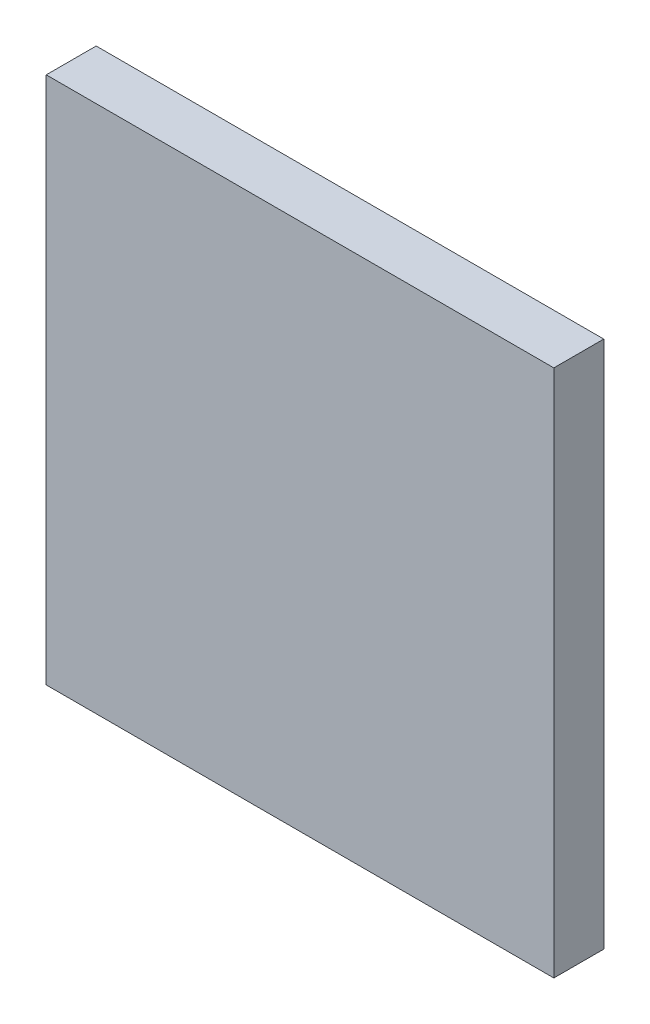
ISO-10303-21;
HEADER;
FILE_DESCRIPTION(('STEP AP214'),'2;1');
FILE_NAME('part.step','',(''),(''),'','','');
FILE_SCHEMA(('AUTOMOTIVE_DESIGN { 1 0 10303 214 1 1 1 1 }'));
ENDSEC;
DATA;
#1=APPLICATION_CONTEXT('core data for automotive mechanical design processes');
#2=APPLICATION_PROTOCOL_DEFINITION('international standard','automotive_design',2000,#1);
#3=PRODUCT_CONTEXT('',#1,'mechanical');
#4=PRODUCT('Part','Part','',(#3));
#5=PRODUCT_RELATED_PRODUCT_CATEGORY('part','',(#4));
#6=PRODUCT_DEFINITION_FORMATION('','',#4);
#7=PRODUCT_DEFINITION_CONTEXT('part definition',#1,'design');
#8=PRODUCT_DEFINITION('design','',#6,#7);
#9=PRODUCT_DEFINITION_SHAPE('','',#8);
#10=(LENGTH_UNIT() NAMED_UNIT(*) SI_UNIT(.MILLI.,.METRE.));
#11=(NAMED_UNIT(*) PLANE_ANGLE_UNIT() SI_UNIT($,.RADIAN.));
#12=(NAMED_UNIT(*) SI_UNIT($,.STERADIAN.) SOLID_ANGLE_UNIT());
#13=UNCERTAINTY_MEASURE_WITH_UNIT(LENGTH_MEASURE(1.E-05),#10,'distance_accuracy_value','');
#14=(GEOMETRIC_REPRESENTATION_CONTEXT(3) GLOBAL_UNCERTAINTY_ASSIGNED_CONTEXT((#13)) GLOBAL_UNIT_ASSIGNED_CONTEXT((#10,
#11,#12)) REPRESENTATION_CONTEXT('',''));
#15=CARTESIAN_POINT('',(0.,0.,0.));
#16=DIRECTION('',(0.,0.,1.));
#17=DIRECTION('',(1.,0.,0.));
#18=AXIS2_PLACEMENT_3D('',#15,#16,#17);
#19=CARTESIAN_POINT('',(122.,127.,24.));
#20=DIRECTION('',(-1.,0.,0.));
#21=DIRECTION('',(0.,-1.,0.));
#22=AXIS2_PLACEMENT_3D('',#19,#20,#21);
#23=PLANE('',#22);
#24=DIRECTION('',(0.,1.,0.));
#25=VECTOR('',#24,1.);
#26=CARTESIAN_POINT('',(122.,127.,0.));
#27=LINE('',#26,#25);
#28=CARTESIAN_POINT('',(122.,-127.,0.));
#29=VERTEX_POINT('',#28);
#30=CARTESIAN_POINT('',(122.,127.,0.));
#31=VERTEX_POINT('',#30);
#32=EDGE_CURVE('E105',#29,#31,#27,.T.);
#33=ORIENTED_EDGE('',*,*,#32,.T.);
#34=DIRECTION('',(0.,0.,-1.));
#35=VECTOR('',#34,1.);
#36=CARTESIAN_POINT('',(122.,127.,24.));
#37=LINE('',#36,#35);
#38=CARTESIAN_POINT('',(122.,127.,24.));
#39=VERTEX_POINT('',#38);
#40=EDGE_CURVE('E11',#39,#31,#37,.T.);
#41=ORIENTED_EDGE('',*,*,#40,.F.);
#42=DIRECTION('',(0.,1.,0.));
#43=VECTOR('',#42,1.);
#44=CARTESIAN_POINT('',(122.,127.,24.));
#45=LINE('',#44,#43);
#46=CARTESIAN_POINT('',(122.,-127.,24.));
#47=VERTEX_POINT('',#46);
#48=EDGE_CURVE('E93',#47,#39,#45,.T.);
#49=ORIENTED_EDGE('',*,*,#48,.F.);
#50=DIRECTION('',(0.,0.,-1.));
#51=VECTOR('',#50,1.);
#52=CARTESIAN_POINT('',(122.,-127.,24.));
#53=LINE('',#52,#51);
#54=EDGE_CURVE('E101',#47,#29,#53,.T.);
#55=ORIENTED_EDGE('',*,*,#54,.T.);
#56=EDGE_LOOP('',(#33,#41,#49,#55));
#57=FACE_BOUND('',#56,.T.);
#58=ADVANCED_FACE('F42',(#57),#23,.F.);
#59=CARTESIAN_POINT('',(-122.,127.,24.));
#60=DIRECTION('',(0.,-1.,0.));
#61=DIRECTION('',(0.,0.,-1.));
#62=AXIS2_PLACEMENT_3D('',#59,#60,#61);
#63=PLANE('',#62);
#64=DIRECTION('',(-1.,0.,0.));
#65=VECTOR('',#64,1.);
#66=CARTESIAN_POINT('',(-122.,127.,0.));
#67=LINE('',#66,#65);
#68=CARTESIAN_POINT('',(-122.,127.,0.));
#69=VERTEX_POINT('',#68);
#70=EDGE_CURVE('E97',#31,#69,#67,.T.);
#71=ORIENTED_EDGE('',*,*,#70,.T.);
#72=DIRECTION('',(0.,0.,-1.));
#73=VECTOR('',#72,1.);
#74=CARTESIAN_POINT('',(-122.,127.,24.));
#75=LINE('',#74,#73);
#76=CARTESIAN_POINT('',(-122.,127.,24.));
#77=VERTEX_POINT('',#76);
#78=EDGE_CURVE('E50',#77,#69,#75,.T.);
#79=ORIENTED_EDGE('',*,*,#78,.F.);
#80=DIRECTION('',(-1.,0.,0.));
#81=VECTOR('',#80,1.);
#82=CARTESIAN_POINT('',(-122.,127.,24.));
#83=LINE('',#82,#81);
#84=EDGE_CURVE('E88',#39,#77,#83,.T.);
#85=ORIENTED_EDGE('',*,*,#84,.F.);
#86=ORIENTED_EDGE('',*,*,#40,.T.);
#87=EDGE_LOOP('',(#71,#79,#85,#86));
#88=FACE_BOUND('',#87,.T.);
#89=ADVANCED_FACE('F96',(#88),#63,.F.);
#90=CARTESIAN_POINT('',(-122.,127.,24.));
#91=DIRECTION('',(1.,0.,0.));
#92=DIRECTION('',(0.,1.,0.));
#93=AXIS2_PLACEMENT_3D('',#90,#91,#92);
#94=PLANE('',#93);
#95=DIRECTION('',(0.,-1.,0.));
#96=VECTOR('',#95,1.);
#97=CARTESIAN_POINT('',(-122.,127.,0.));
#98=LINE('',#97,#96);
#99=CARTESIAN_POINT('',(-122.,-127.,0.));
#100=VERTEX_POINT('',#99);
#101=EDGE_CURVE('E75',#69,#100,#98,.T.);
#102=ORIENTED_EDGE('',*,*,#101,.T.);
#103=DIRECTION('',(0.,0.,-1.));
#104=VECTOR('',#103,1.);
#105=CARTESIAN_POINT('',(-122.,-127.,24.));
#106=LINE('',#105,#104);
#107=CARTESIAN_POINT('',(-122.,-127.,24.));
#108=VERTEX_POINT('',#107);
#109=EDGE_CURVE('E98',#108,#100,#106,.T.);
#110=ORIENTED_EDGE('',*,*,#109,.F.);
#111=DIRECTION('',(0.,-1.,0.));
#112=VECTOR('',#111,1.);
#113=CARTESIAN_POINT('',(-122.,127.,24.));
#114=LINE('',#113,#112);
#115=EDGE_CURVE('E91',#77,#108,#114,.T.);
#116=ORIENTED_EDGE('',*,*,#115,.F.);
#117=ORIENTED_EDGE('',*,*,#78,.T.);
#118=EDGE_LOOP('',(#102,#110,#116,#117));
#119=FACE_BOUND('',#118,.T.);
#120=ADVANCED_FACE('F99',(#119),#94,.F.);
#121=CARTESIAN_POINT('',(-122.,-127.,24.));
#122=DIRECTION('',(0.,1.,0.));
#123=DIRECTION('',(0.,0.,1.));
#124=AXIS2_PLACEMENT_3D('',#121,#122,#123);
#125=PLANE('',#124);
#126=DIRECTION('',(1.,0.,0.));
#127=VECTOR('',#126,1.);
#128=CARTESIAN_POINT('',(-122.,-127.,0.));
#129=LINE('',#128,#127);
#130=EDGE_CURVE('E81',#100,#29,#129,.T.);
#131=ORIENTED_EDGE('',*,*,#130,.T.);
#132=ORIENTED_EDGE('',*,*,#54,.F.);
#133=DIRECTION('',(1.,0.,0.));
#134=VECTOR('',#133,1.);
#135=CARTESIAN_POINT('',(-122.,-127.,24.));
#136=LINE('',#135,#134);
#137=EDGE_CURVE('E58',#108,#47,#136,.T.);
#138=ORIENTED_EDGE('',*,*,#137,.F.);
#139=ORIENTED_EDGE('',*,*,#109,.T.);
#140=EDGE_LOOP('',(#131,#132,#138,#139));
#141=FACE_BOUND('',#140,.T.);
#142=ADVANCED_FACE('F112',(#141),#125,.F.);
#143=CARTESIAN_POINT('',(0.,0.,24.));
#144=DIRECTION('',(0.,0.,1.));
#145=DIRECTION('',(1.,0.,0.));
#146=AXIS2_PLACEMENT_3D('',#143,#144,#145);
#147=PLANE('',#146);
#148=ORIENTED_EDGE('',*,*,#48,.T.);
#149=ORIENTED_EDGE('',*,*,#84,.T.);
#150=ORIENTED_EDGE('',*,*,#115,.T.);
#151=ORIENTED_EDGE('',*,*,#137,.T.);
#152=EDGE_LOOP('',(#148,#149,#150,#151));
#153=FACE_BOUND('',#152,.T.);
#154=ADVANCED_FACE('F89',(#153),#147,.T.);
#155=CARTESIAN_POINT('',(0.,0.,0.));
#156=DIRECTION('',(0.,0.,1.));
#157=DIRECTION('',(1.,0.,0.));
#158=AXIS2_PLACEMENT_3D('',#155,#156,#157);
#159=PLANE('',#158);
#160=ORIENTED_EDGE('',*,*,#32,.F.);
#161=ORIENTED_EDGE('',*,*,#130,.F.);
#162=ORIENTED_EDGE('',*,*,#101,.F.);
#163=ORIENTED_EDGE('',*,*,#70,.F.);
#164=EDGE_LOOP('',(#160,#161,#162,#163));
#165=FACE_BOUND('',#164,.T.);
#166=ADVANCED_FACE('F115',(#165),#159,.F.);
#167=CLOSED_SHELL('',(#58,#89,#120,#142,#154,#166));
#168=MANIFOLD_SOLID_BREP('B2',#167);
#169=ADVANCED_BREP_SHAPE_REPRESENTATION('',(#18,#168),#14);
#170=SHAPE_DEFINITION_REPRESENTATION(#9,#169);
ENDSEC;
END-ISO-10303-21;
